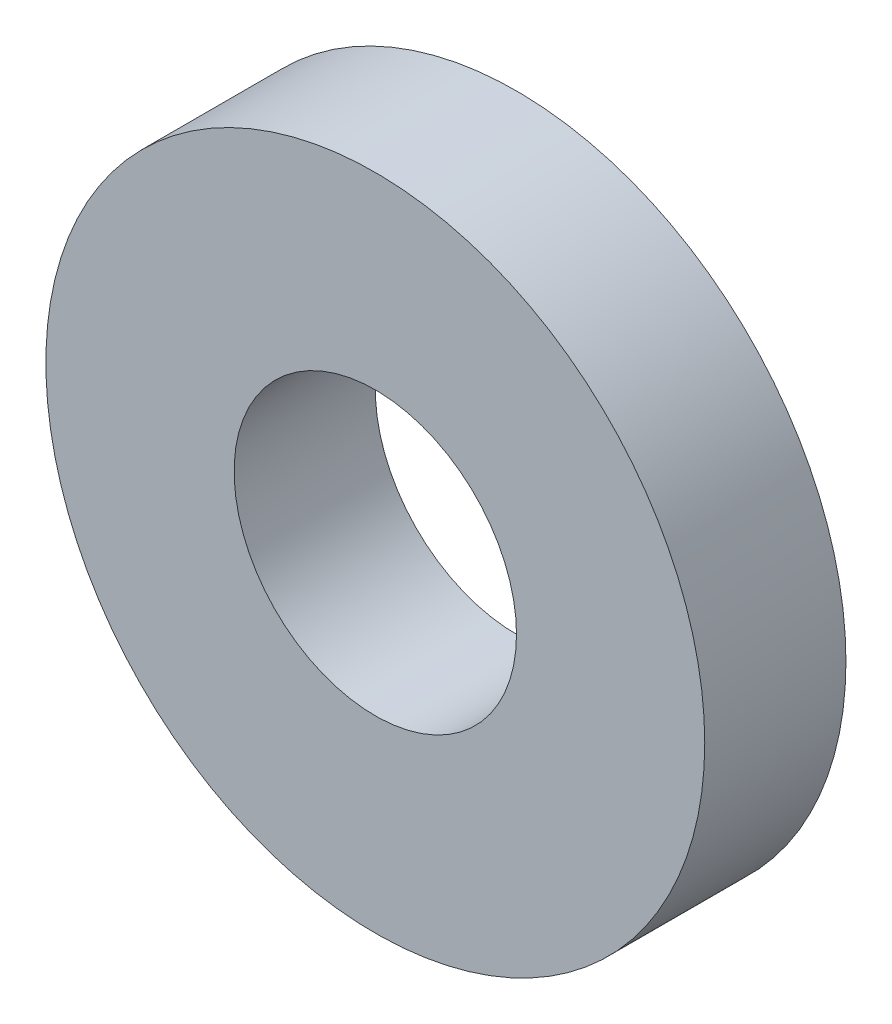
ISO-10303-21;
HEADER;
FILE_DESCRIPTION(('STEP AP214'),'2;1');
FILE_NAME('part.step','',(''),(''),'','','');
FILE_SCHEMA(('AUTOMOTIVE_DESIGN { 1 0 10303 214 1 1 1 1 }'));
ENDSEC;
DATA;
#1=APPLICATION_CONTEXT('core data for automotive mechanical design processes');
#2=APPLICATION_PROTOCOL_DEFINITION('international standard','automotive_design',2000,#1);
#3=PRODUCT_CONTEXT('',#1,'mechanical');
#4=PRODUCT('Part','Part','',(#3));
#5=PRODUCT_RELATED_PRODUCT_CATEGORY('part','',(#4));
#6=PRODUCT_DEFINITION_FORMATION('','',#4);
#7=PRODUCT_DEFINITION_CONTEXT('part definition',#1,'design');
#8=PRODUCT_DEFINITION('design','',#6,#7);
#9=PRODUCT_DEFINITION_SHAPE('','',#8);
#10=(LENGTH_UNIT() NAMED_UNIT(*) SI_UNIT(.MILLI.,.METRE.));
#11=(NAMED_UNIT(*) PLANE_ANGLE_UNIT() SI_UNIT($,.RADIAN.));
#12=(NAMED_UNIT(*) SI_UNIT($,.STERADIAN.) SOLID_ANGLE_UNIT());
#13=UNCERTAINTY_MEASURE_WITH_UNIT(LENGTH_MEASURE(1.E-05),#10,'distance_accuracy_value','');
#14=(GEOMETRIC_REPRESENTATION_CONTEXT(3) GLOBAL_UNCERTAINTY_ASSIGNED_CONTEXT((#13)) GLOBAL_UNIT_ASSIGNED_CONTEXT((#10,
#11,#12)) REPRESENTATION_CONTEXT('',''));
#15=CARTESIAN_POINT('',(0.,0.,0.));
#16=DIRECTION('',(0.,0.,1.));
#17=DIRECTION('',(1.,0.,0.));
#18=AXIS2_PLACEMENT_3D('',#15,#16,#17);
#19=CARTESIAN_POINT('',(0.,0.,3.));
#20=DIRECTION('',(0.,0.,1.));
#21=DIRECTION('',(1.,0.,0.));
#22=AXIS2_PLACEMENT_3D('',#19,#20,#21);
#23=PLANE('',#22);
#24=CARTESIAN_POINT('',(0.,0.,3.));
#25=DIRECTION('',(0.,0.,1.));
#26=DIRECTION('',(1.,0.,0.));
#27=AXIS2_PLACEMENT_3D('',#24,#25,#26);
#28=CIRCLE('',#27,7.);
#29=CARTESIAN_POINT('',(7.,0.,3.));
#30=VERTEX_POINT('',#29);
#31=EDGE_CURVE('E10',#30,#30,#28,.T.);
#32=ORIENTED_EDGE('',*,*,#31,.T.);
#33=EDGE_LOOP('',(#32));
#34=FACE_BOUND('',#33,.T.);
#35=CARTESIAN_POINT('',(0.,0.,3.));
#36=DIRECTION('',(0.,0.,1.));
#37=DIRECTION('',(1.,0.,0.));
#38=AXIS2_PLACEMENT_3D('',#35,#36,#37);
#39=CIRCLE('',#38,3.);
#40=CARTESIAN_POINT('',(3.,0.,3.));
#41=VERTEX_POINT('',#40);
#42=EDGE_CURVE('E41',#41,#41,#39,.T.);
#43=ORIENTED_EDGE('',*,*,#42,.F.);
#44=EDGE_LOOP('',(#43));
#45=FACE_BOUND('',#44,.T.);
#46=ADVANCED_FACE('F30',(#34,#45),#23,.T.);
#47=CARTESIAN_POINT('',(0.,0.,0.));
#48=DIRECTION('',(0.,0.,1.));
#49=DIRECTION('',(1.,0.,0.));
#50=AXIS2_PLACEMENT_3D('',#47,#48,#49);
#51=PLANE('',#50);
#52=CARTESIAN_POINT('',(0.,0.,0.));
#53=DIRECTION('',(0.,0.,1.));
#54=DIRECTION('',(1.,0.,0.));
#55=AXIS2_PLACEMENT_3D('',#52,#53,#54);
#56=CIRCLE('',#55,7.);
#57=CARTESIAN_POINT('',(7.,0.,0.));
#58=VERTEX_POINT('',#57);
#59=EDGE_CURVE('E34',#58,#58,#56,.T.);
#60=ORIENTED_EDGE('',*,*,#59,.F.);
#61=EDGE_LOOP('',(#60));
#62=FACE_BOUND('',#61,.T.);
#63=CARTESIAN_POINT('',(0.,0.,0.));
#64=DIRECTION('',(0.,0.,1.));
#65=DIRECTION('',(1.,0.,0.));
#66=AXIS2_PLACEMENT_3D('',#63,#64,#65);
#67=CIRCLE('',#66,3.);
#68=CARTESIAN_POINT('',(3.,0.,0.));
#69=VERTEX_POINT('',#68);
#70=EDGE_CURVE('E43',#69,#69,#67,.T.);
#71=ORIENTED_EDGE('',*,*,#70,.T.);
#72=EDGE_LOOP('',(#71));
#73=FACE_BOUND('',#72,.T.);
#74=ADVANCED_FACE('F53',(#62,#73),#51,.F.);
#75=CARTESIAN_POINT('',(0.,0.,3.));
#76=DIRECTION('',(0.,0.,-1.));
#77=DIRECTION('',(-1.,0.,0.));
#78=AXIS2_PLACEMENT_3D('',#75,#76,#77);
#79=CYLINDRICAL_SURFACE('',#78,7.);
#80=ORIENTED_EDGE('',*,*,#31,.F.);
#81=EDGE_LOOP('',(#80));
#82=FACE_BOUND('',#81,.T.);
#83=ORIENTED_EDGE('',*,*,#59,.T.);
#84=EDGE_LOOP('',(#83));
#85=FACE_BOUND('',#84,.T.);
#86=ADVANCED_FACE('F32',(#82,#85),#79,.T.);
#87=CARTESIAN_POINT('',(0.,0.,3.));
#88=DIRECTION('',(0.,0.,-1.));
#89=DIRECTION('',(-1.,0.,0.));
#90=AXIS2_PLACEMENT_3D('',#87,#88,#89);
#91=CYLINDRICAL_SURFACE('',#90,3.);
#92=ORIENTED_EDGE('',*,*,#42,.T.);
#93=EDGE_LOOP('',(#92));
#94=FACE_BOUND('',#93,.T.);
#95=ORIENTED_EDGE('',*,*,#70,.F.);
#96=EDGE_LOOP('',(#95));
#97=FACE_BOUND('',#96,.T.);
#98=ADVANCED_FACE('F49',(#94,#97),#91,.F.);
#99=CLOSED_SHELL('',(#46,#74,#86,#98));
#100=MANIFOLD_SOLID_BREP('B2',#99);
#101=ADVANCED_BREP_SHAPE_REPRESENTATION('',(#18,#100),#14);
#102=SHAPE_DEFINITION_REPRESENTATION(#9,#101);
ENDSEC;
END-ISO-10303-21;
